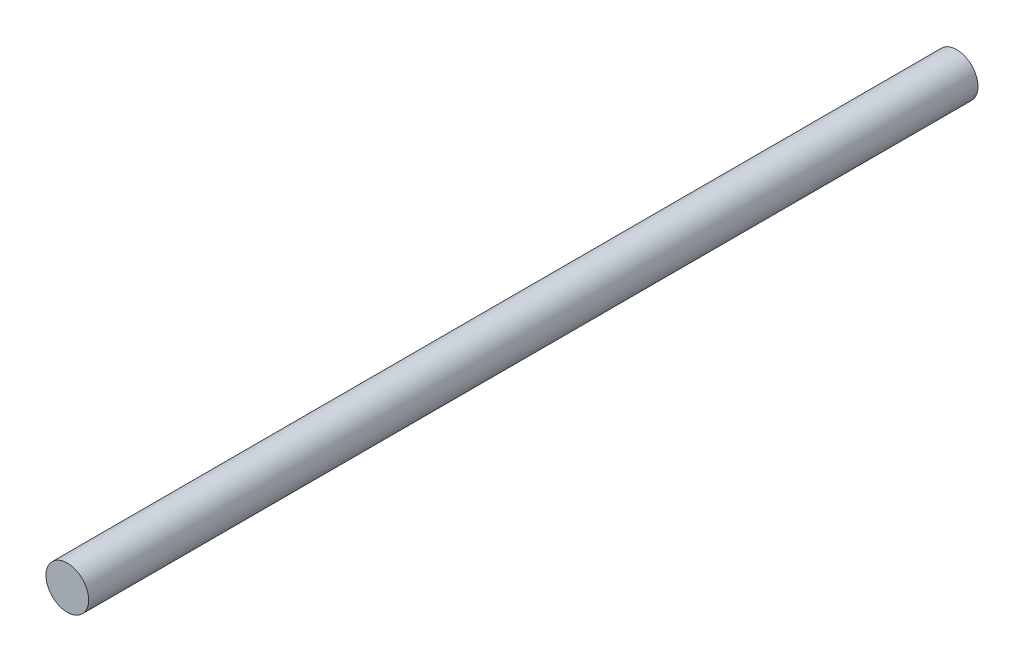
ISO-10303-21;
HEADER;
FILE_DESCRIPTION(('STEP AP214'),'2;1');
FILE_NAME('part.step','',(''),(''),'','','');
FILE_SCHEMA(('AUTOMOTIVE_DESIGN { 1 0 10303 214 1 1 1 1 }'));
ENDSEC;
DATA;
#1=APPLICATION_CONTEXT('core data for automotive mechanical design processes');
#2=APPLICATION_PROTOCOL_DEFINITION('international standard','automotive_design',2000,#1);
#3=PRODUCT_CONTEXT('',#1,'mechanical');
#4=PRODUCT('Part','Part','',(#3));
#5=PRODUCT_RELATED_PRODUCT_CATEGORY('part','',(#4));
#6=PRODUCT_DEFINITION_FORMATION('','',#4);
#7=PRODUCT_DEFINITION_CONTEXT('part definition',#1,'design');
#8=PRODUCT_DEFINITION('design','',#6,#7);
#9=PRODUCT_DEFINITION_SHAPE('','',#8);
#10=(LENGTH_UNIT() NAMED_UNIT(*) SI_UNIT(.MILLI.,.METRE.));
#11=(NAMED_UNIT(*) PLANE_ANGLE_UNIT() SI_UNIT($,.RADIAN.));
#12=(NAMED_UNIT(*) SI_UNIT($,.STERADIAN.) SOLID_ANGLE_UNIT());
#13=UNCERTAINTY_MEASURE_WITH_UNIT(LENGTH_MEASURE(1.E-05),#10,'distance_accuracy_value','');
#14=(GEOMETRIC_REPRESENTATION_CONTEXT(3) GLOBAL_UNCERTAINTY_ASSIGNED_CONTEXT((#13)) GLOBAL_UNIT_ASSIGNED_CONTEXT((#10,
#11,#12)) REPRESENTATION_CONTEXT('',''));
#15=CARTESIAN_POINT('',(0.,0.,0.));
#16=DIRECTION('',(0.,0.,1.));
#17=DIRECTION('',(1.,0.,0.));
#18=AXIS2_PLACEMENT_3D('',#15,#16,#17);
#19=CARTESIAN_POINT('',(0.,0.,250.));
#20=DIRECTION('',(0.,0.,-1.));
#21=DIRECTION('',(-1.,0.,0.));
#22=AXIS2_PLACEMENT_3D('',#19,#20,#21);
#23=CYLINDRICAL_SURFACE('',#22,6.);
#24=CARTESIAN_POINT('',(0.,0.,250.));
#25=DIRECTION('',(0.,0.,1.));
#26=DIRECTION('',(1.,0.,0.));
#27=AXIS2_PLACEMENT_3D('',#24,#25,#26);
#28=CIRCLE('',#27,6.);
#29=CARTESIAN_POINT('',(6.,0.,250.));
#30=VERTEX_POINT('',#29);
#31=EDGE_CURVE('E10',#30,#30,#28,.T.);
#32=ORIENTED_EDGE('',*,*,#31,.F.);
#33=EDGE_LOOP('',(#32));
#34=FACE_BOUND('',#33,.T.);
#35=CARTESIAN_POINT('',(0.,0.,0.));
#36=DIRECTION('',(0.,0.,1.));
#37=DIRECTION('',(1.,0.,0.));
#38=AXIS2_PLACEMENT_3D('',#35,#36,#37);
#39=CIRCLE('',#38,6.);
#40=CARTESIAN_POINT('',(6.,0.,0.));
#41=VERTEX_POINT('',#40);
#42=EDGE_CURVE('E34',#41,#41,#39,.T.);
#43=ORIENTED_EDGE('',*,*,#42,.T.);
#44=EDGE_LOOP('',(#43));
#45=FACE_BOUND('',#44,.T.);
#46=ADVANCED_FACE('F31',(#34,#45),#23,.T.);
#47=CARTESIAN_POINT('',(0.,0.,250.));
#48=DIRECTION('',(0.,0.,1.));
#49=DIRECTION('',(1.,0.,0.));
#50=AXIS2_PLACEMENT_3D('',#47,#48,#49);
#51=PLANE('',#50);
#52=ORIENTED_EDGE('',*,*,#31,.T.);
#53=EDGE_LOOP('',(#52));
#54=FACE_BOUND('',#53,.T.);
#55=ADVANCED_FACE('F46',(#54),#51,.T.);
#56=CARTESIAN_POINT('',(0.,0.,0.));
#57=DIRECTION('',(0.,0.,1.));
#58=DIRECTION('',(1.,0.,0.));
#59=AXIS2_PLACEMENT_3D('',#56,#57,#58);
#60=PLANE('',#59);
#61=ORIENTED_EDGE('',*,*,#42,.F.);
#62=EDGE_LOOP('',(#61));
#63=FACE_BOUND('',#62,.T.);
#64=ADVANCED_FACE('F44',(#63),#60,.F.);
#65=CLOSED_SHELL('',(#46,#55,#64));
#66=MANIFOLD_SOLID_BREP('B2',#65);
#67=ADVANCED_BREP_SHAPE_REPRESENTATION('',(#18,#66),#14);
#68=SHAPE_DEFINITION_REPRESENTATION(#9,#67);
ENDSEC;
END-ISO-10303-21;
